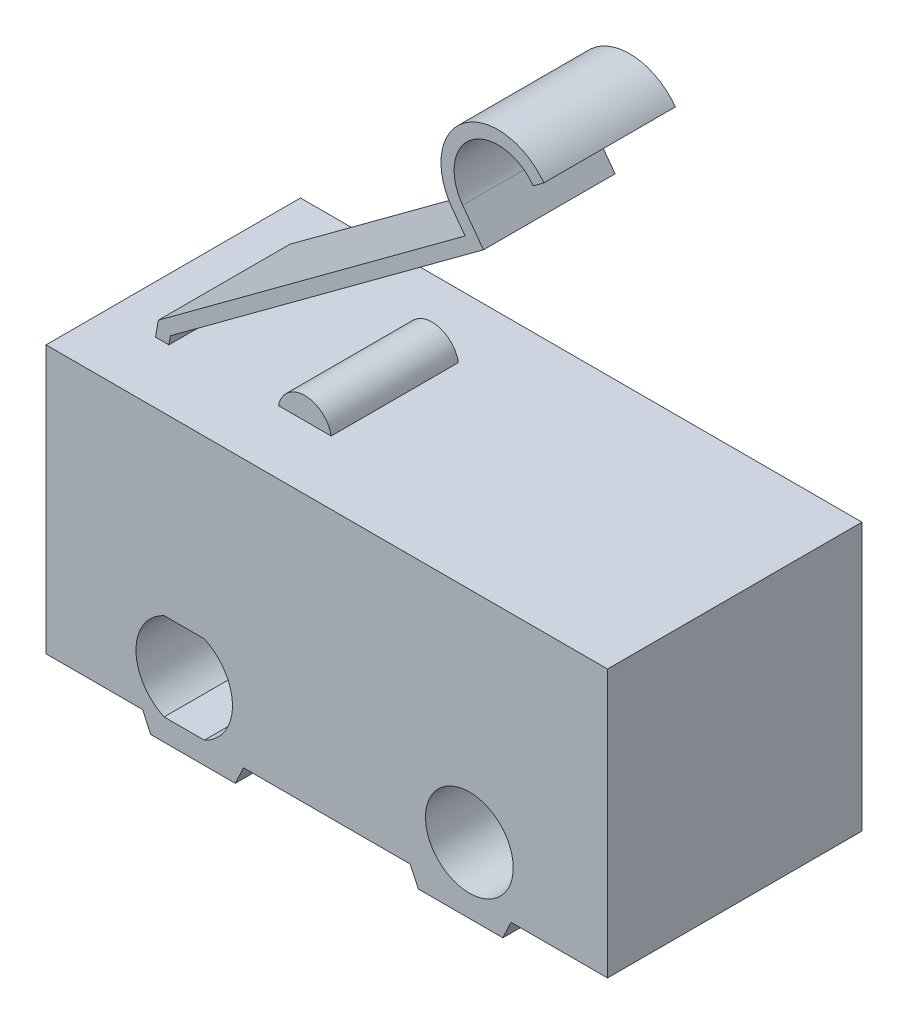
ISO-10303-21;
HEADER;
FILE_DESCRIPTION(('STEP AP214'),'2;1');
FILE_NAME('part.step','',(''),(''),'','','');
FILE_SCHEMA(('AUTOMOTIVE_DESIGN { 1 0 10303 214 1 1 1 1 }'));
ENDSEC;
DATA;
#1=APPLICATION_CONTEXT('core data for automotive mechanical design processes');
#2=APPLICATION_PROTOCOL_DEFINITION('international standard','automotive_design',2000,#1);
#3=PRODUCT_CONTEXT('',#1,'mechanical');
#4=PRODUCT('Part','Part','',(#3));
#5=PRODUCT_RELATED_PRODUCT_CATEGORY('part','',(#4));
#6=PRODUCT_DEFINITION_FORMATION('','',#4);
#7=PRODUCT_DEFINITION_CONTEXT('part definition',#1,'design');
#8=PRODUCT_DEFINITION('design','',#6,#7);
#9=PRODUCT_DEFINITION_SHAPE('','',#8);
#10=(LENGTH_UNIT() NAMED_UNIT(*) SI_UNIT(.MILLI.,.METRE.));
#11=(NAMED_UNIT(*) PLANE_ANGLE_UNIT() SI_UNIT($,.RADIAN.));
#12=(NAMED_UNIT(*) SI_UNIT($,.STERADIAN.) SOLID_ANGLE_UNIT());
#13=UNCERTAINTY_MEASURE_WITH_UNIT(LENGTH_MEASURE(1.E-05),#10,'distance_accuracy_value','');
#14=(GEOMETRIC_REPRESENTATION_CONTEXT(3) GLOBAL_UNCERTAINTY_ASSIGNED_CONTEXT((#13)) GLOBAL_UNIT_ASSIGNED_CONTEXT((#10,
#11,#12)) REPRESENTATION_CONTEXT('',''));
#15=CARTESIAN_POINT('',(0.,0.,0.));
#16=DIRECTION('',(0.,0.,1.));
#17=DIRECTION('',(1.,0.,0.));
#18=AXIS2_PLACEMENT_3D('',#15,#16,#17);
#19=CARTESIAN_POINT('',(0.,6.5,0.));
#20=DIRECTION('',(0.,1.,0.));
#21=DIRECTION('',(0.,0.,1.));
#22=AXIS2_PLACEMENT_3D('',#19,#20,#21);
#23=PLANE('',#22);
#24=DIRECTION('',(0.,0.,-1.));
#25=VECTOR('',#24,1.);
#26=CARTESIAN_POINT('',(-5.30572957496815,6.5,-0.75));
#27=LINE('',#26,#25);
#28=CARTESIAN_POINT('',(-5.30572957496815,6.5,1.5));
#29=VERTEX_POINT('',#28);
#30=CARTESIAN_POINT('',(-5.30572957496815,6.5,-1.5));
#31=VERTEX_POINT('',#30);
#32=EDGE_CURVE('E11',#29,#31,#27,.T.);
#33=ORIENTED_EDGE('',*,*,#32,.T.);
#34=DIRECTION('',(1.,0.,0.));
#35=VECTOR('',#34,1.);
#36=CARTESIAN_POINT('',(-0.390223600528357,6.5,-1.5));
#37=LINE('',#36,#35);
#38=CARTESIAN_POINT('',(-5.00000297242953,6.5,-1.5));
#39=VERTEX_POINT('',#38);
#40=EDGE_CURVE('E20',#31,#39,#37,.T.);
#41=ORIENTED_EDGE('',*,*,#40,.T.);
#42=DIRECTION('',(0.,0.,1.));
#43=VECTOR('',#42,1.);
#44=CARTESIAN_POINT('',(-5.00000297242953,6.5,-0.75));
#45=LINE('',#44,#43);
#46=CARTESIAN_POINT('',(-5.00000297242953,6.5,1.5));
#47=VERTEX_POINT('',#46);
#48=EDGE_CURVE('E346',#39,#47,#45,.T.);
#49=ORIENTED_EDGE('',*,*,#48,.T.);
#50=DIRECTION('',(-1.,0.,0.));
#51=VECTOR('',#50,1.);
#52=CARTESIAN_POINT('',(-0.390223600528357,6.5,1.5));
#53=LINE('',#52,#51);
#54=EDGE_CURVE('E313',#47,#29,#53,.T.);
#55=ORIENTED_EDGE('',*,*,#54,.T.);
#56=EDGE_LOOP('',(#33,#41,#49,#55));
#57=FACE_BOUND('',#56,.T.);
#58=DIRECTION('',(0.,0.,1.));
#59=VECTOR('',#58,1.);
#60=CARTESIAN_POINT('',(-1.35,6.5,0.));
#61=LINE('',#60,#59);
#62=CARTESIAN_POINT('',(-1.35,6.5,-1.45));
#63=VERTEX_POINT('',#62);
#64=CARTESIAN_POINT('',(-1.35,6.5,1.45));
#65=VERTEX_POINT('',#64);
#66=EDGE_CURVE('E310',#63,#65,#61,.T.);
#67=ORIENTED_EDGE('',*,*,#66,.T.);
#68=DIRECTION('',(-1.,0.,0.));
#69=VECTOR('',#68,1.);
#70=CARTESIAN_POINT('',(-0.975,6.5,1.45));
#71=LINE('',#70,#69);
#72=CARTESIAN_POINT('',(-2.55,6.5,1.45));
#73=VERTEX_POINT('',#72);
#74=EDGE_CURVE('E314',#65,#73,#71,.T.);
#75=ORIENTED_EDGE('',*,*,#74,.T.);
#76=DIRECTION('',(0.,0.,-1.));
#77=VECTOR('',#76,1.);
#78=CARTESIAN_POINT('',(-2.55,6.5,0.));
#79=LINE('',#78,#77);
#80=CARTESIAN_POINT('',(-2.55,6.5,-1.45));
#81=VERTEX_POINT('',#80);
#82=EDGE_CURVE('E290',#73,#81,#79,.T.);
#83=ORIENTED_EDGE('',*,*,#82,.T.);
#84=DIRECTION('',(1.,0.,0.));
#85=VECTOR('',#84,1.);
#86=CARTESIAN_POINT('',(-0.975,6.5,-1.45));
#87=LINE('',#86,#85);
#88=EDGE_CURVE('E287',#81,#63,#87,.T.);
#89=ORIENTED_EDGE('',*,*,#88,.T.);
#90=EDGE_LOOP('',(#67,#75,#83,#89));
#91=FACE_BOUND('',#90,.T.);
#92=DIRECTION('',(0.,0.,-1.));
#93=VECTOR('',#92,1.);
#94=CARTESIAN_POINT('',(6.4,6.5,0.));
#95=LINE('',#94,#93);
#96=CARTESIAN_POINT('',(6.4,6.5,2.9));
#97=VERTEX_POINT('',#96);
#98=CARTESIAN_POINT('',(6.4,6.5,-2.9));
#99=VERTEX_POINT('',#98);
#100=EDGE_CURVE('E291',#97,#99,#95,.T.);
#101=ORIENTED_EDGE('',*,*,#100,.T.);
#102=DIRECTION('',(1.,0.,0.));
#103=VECTOR('',#102,1.);
#104=CARTESIAN_POINT('',(0.,6.5,-2.9));
#105=LINE('',#104,#103);
#106=CARTESIAN_POINT('',(-6.4,6.5,-2.9));
#107=VERTEX_POINT('',#106);
#108=EDGE_CURVE('E225',#107,#99,#105,.T.);
#109=ORIENTED_EDGE('',*,*,#108,.F.);
#110=DIRECTION('',(0.,0.,-1.));
#111=VECTOR('',#110,1.);
#112=CARTESIAN_POINT('',(-6.4,6.5,0.));
#113=LINE('',#112,#111);
#114=CARTESIAN_POINT('',(-6.4,6.5,2.9));
#115=VERTEX_POINT('',#114);
#116=EDGE_CURVE('E256',#115,#107,#113,.T.);
#117=ORIENTED_EDGE('',*,*,#116,.F.);
#118=DIRECTION('',(-1.,0.,0.));
#119=VECTOR('',#118,1.);
#120=CARTESIAN_POINT('',(0.,6.5,2.9));
#121=LINE('',#120,#119);
#122=EDGE_CURVE('E298',#97,#115,#121,.T.);
#123=ORIENTED_EDGE('',*,*,#122,.F.);
#124=EDGE_LOOP('',(#101,#109,#117,#123));
#125=FACE_BOUND('',#124,.T.);
#126=ADVANCED_FACE('F16',(#57,#91,#125),#23,.T.);
#127=CARTESIAN_POINT('',(-6.4,3.25,0.));
#128=DIRECTION('',(-1.,0.,0.));
#129=DIRECTION('',(0.,0.,1.));
#130=AXIS2_PLACEMENT_3D('',#127,#128,#129);
#131=PLANE('',#130);
#132=DIRECTION('',(0.,0.,1.));
#133=VECTOR('',#132,1.);
#134=CARTESIAN_POINT('',(-6.4,0.400000000000001,-2.5));
#135=LINE('',#134,#133);
#136=CARTESIAN_POINT('',(-6.4,0.400000000000001,-2.9));
#137=VERTEX_POINT('',#136);
#138=CARTESIAN_POINT('',(-6.4,0.400000000000001,2.9));
#139=VERTEX_POINT('',#138);
#140=EDGE_CURVE('E259',#137,#139,#135,.T.);
#141=ORIENTED_EDGE('',*,*,#140,.T.);
#142=DIRECTION('',(0.,-1.,0.));
#143=VECTOR('',#142,1.);
#144=CARTESIAN_POINT('',(-6.4,3.25,2.9));
#145=LINE('',#144,#143);
#146=EDGE_CURVE('E295',#115,#139,#145,.T.);
#147=ORIENTED_EDGE('',*,*,#146,.F.);
#148=ORIENTED_EDGE('',*,*,#116,.T.);
#149=DIRECTION('',(0.,1.,0.));
#150=VECTOR('',#149,1.);
#151=CARTESIAN_POINT('',(-6.4,3.25,-2.9));
#152=LINE('',#151,#150);
#153=EDGE_CURVE('E228',#137,#107,#152,.T.);
#154=ORIENTED_EDGE('',*,*,#153,.F.);
#155=EDGE_LOOP('',(#141,#147,#148,#154));
#156=FACE_BOUND('',#155,.T.);
#157=ADVANCED_FACE('F500',(#156),#131,.T.);
#158=CARTESIAN_POINT('',(0.,0.,0.));
#159=DIRECTION('',(0.,-1.,0.));
#160=DIRECTION('',(0.,0.,-1.));
#161=AXIS2_PLACEMENT_3D('',#158,#159,#160);
#162=PLANE('',#161);
#163=DIRECTION('',(0.,0.,1.));
#164=VECTOR('',#163,1.);
#165=CARTESIAN_POINT('',(4.013476936738,0.,-2.5));
#166=LINE('',#165,#164);
#167=CARTESIAN_POINT('',(4.013476936738,0.,-2.9));
#168=VERTEX_POINT('',#167);
#169=CARTESIAN_POINT('',(4.013476936738,0.,2.9));
#170=VERTEX_POINT('',#169);
#171=EDGE_CURVE('E237',#168,#170,#166,.T.);
#172=ORIENTED_EDGE('',*,*,#171,.T.);
#173=DIRECTION('',(1.,0.,0.));
#174=VECTOR('',#173,1.);
#175=CARTESIAN_POINT('',(0.,0.,2.9));
#176=LINE('',#175,#174);
#177=CARTESIAN_POINT('',(2.086523063262,0.,2.9));
#178=VERTEX_POINT('',#177);
#179=EDGE_CURVE('E376',#178,#170,#176,.T.);
#180=ORIENTED_EDGE('',*,*,#179,.F.);
#181=DIRECTION('',(0.,0.,-1.));
#182=VECTOR('',#181,1.);
#183=CARTESIAN_POINT('',(2.086523063262,0.,-2.5));
#184=LINE('',#183,#182);
#185=CARTESIAN_POINT('',(2.086523063262,0.,-2.9));
#186=VERTEX_POINT('',#185);
#187=EDGE_CURVE('E234',#178,#186,#184,.T.);
#188=ORIENTED_EDGE('',*,*,#187,.T.);
#189=DIRECTION('',(-1.,0.,0.));
#190=VECTOR('',#189,1.);
#191=CARTESIAN_POINT('',(0.,0.,-2.9));
#192=LINE('',#191,#190);
#193=EDGE_CURVE('E230',#168,#186,#192,.T.);
#194=ORIENTED_EDGE('',*,*,#193,.F.);
#195=EDGE_LOOP('',(#172,#180,#188,#194));
#196=FACE_BOUND('',#195,.T.);
#197=ADVANCED_FACE('F483',(#196),#162,.T.);
#198=CARTESIAN_POINT('',(0.,3.25,2.9));
#199=DIRECTION('',(0.,0.,1.));
#200=DIRECTION('',(1.,0.,0.));
#201=AXIS2_PLACEMENT_3D('',#198,#199,#200);
#202=PLANE('',#201);
#203=CARTESIAN_POINT('',(3.25,1.5,2.9));
#204=DIRECTION('',(0.,0.,-1.));
#205=DIRECTION('',(1.,0.,0.));
#206=AXIS2_PLACEMENT_3D('',#203,#204,#205);
#207=CIRCLE('',#206,1.);
#208=CARTESIAN_POINT('',(4.25,1.5,2.9));
#209=VERTEX_POINT('',#208);
#210=EDGE_CURVE('E238',#209,#209,#207,.T.);
#211=ORIENTED_EDGE('',*,*,#210,.T.);
#212=EDGE_LOOP('',(#211));
#213=FACE_BOUND('',#212,.T.);
#214=DIRECTION('',(1.,0.,0.));
#215=VECTOR('',#214,1.);
#216=CARTESIAN_POINT('',(-1.25,2.5,2.9));
#217=LINE('',#216,#215);
#218=CARTESIAN_POINT('',(-3.70825756949558,2.5,2.9));
#219=VERTEX_POINT('',#218);
#220=CARTESIAN_POINT('',(-2.79174243050442,2.5,2.9));
#221=VERTEX_POINT('',#220);
#222=EDGE_CURVE('E245',#219,#221,#217,.T.);
#223=ORIENTED_EDGE('',*,*,#222,.T.);
#224=CARTESIAN_POINT('',(-3.25,1.5,2.9));
#225=DIRECTION('',(0.,0.,-1.));
#226=DIRECTION('',(1.,0.,0.));
#227=AXIS2_PLACEMENT_3D('',#224,#225,#226);
#228=CIRCLE('',#227,1.1);
#229=CARTESIAN_POINT('',(-2.79174243050442,0.5,2.9));
#230=VERTEX_POINT('',#229);
#231=EDGE_CURVE('E283',#221,#230,#228,.T.);
#232=ORIENTED_EDGE('',*,*,#231,.T.);
#233=DIRECTION('',(-1.,0.,0.));
#234=VECTOR('',#233,1.);
#235=CARTESIAN_POINT('',(-1.25,0.5,2.9));
#236=LINE('',#235,#234);
#237=CARTESIAN_POINT('',(-3.70825756949558,0.5,2.9));
#238=VERTEX_POINT('',#237);
#239=EDGE_CURVE('E280',#230,#238,#236,.T.);
#240=ORIENTED_EDGE('',*,*,#239,.T.);
#241=CARTESIAN_POINT('',(-3.25,1.5,2.9));
#242=DIRECTION('',(0.,0.,-1.));
#243=DIRECTION('',(1.,0.,0.));
#244=AXIS2_PLACEMENT_3D('',#241,#242,#243);
#245=CIRCLE('',#244,1.1);
#246=EDGE_CURVE('E272',#238,#219,#245,.T.);
#247=ORIENTED_EDGE('',*,*,#246,.T.);
#248=EDGE_LOOP('',(#223,#232,#240,#247));
#249=FACE_BOUND('',#248,.T.);
#250=DIRECTION('',(1.,0.,0.));
#251=VECTOR('',#250,1.);
#252=CARTESIAN_POINT('',(2.1,0.400000000000001,2.9));
#253=LINE('',#252,#251);
#254=CARTESIAN_POINT('',(4.2,0.400000000000001,2.9));
#255=VERTEX_POINT('',#254);
#256=CARTESIAN_POINT('',(6.4,0.400000000000001,2.9));
#257=VERTEX_POINT('',#256);
#258=EDGE_CURVE('E269',#255,#257,#253,.T.);
#259=ORIENTED_EDGE('',*,*,#258,.T.);
#260=DIRECTION('',(0.,1.,0.));
#261=VECTOR('',#260,1.);
#262=CARTESIAN_POINT('',(6.4,3.25,2.9));
#263=LINE('',#262,#261);
#264=EDGE_CURVE('E273',#257,#97,#263,.T.);
#265=ORIENTED_EDGE('',*,*,#264,.T.);
#266=ORIENTED_EDGE('',*,*,#122,.T.);
#267=ORIENTED_EDGE('',*,*,#146,.T.);
#268=DIRECTION('',(1.,0.,0.));
#269=VECTOR('',#268,1.);
#270=CARTESIAN_POINT('',(-3.6,0.400000000000001,2.9));
#271=LINE('',#270,#269);
#272=CARTESIAN_POINT('',(-4.2,0.400000000000001,2.9));
#273=VERTEX_POINT('',#272);
#274=EDGE_CURVE('E268',#139,#273,#271,.T.);
#275=ORIENTED_EDGE('',*,*,#274,.T.);
#276=DIRECTION('',(0.4226182617407,-0.90630778703665,0.));
#277=VECTOR('',#276,1.);
#278=CARTESIAN_POINT('',(-4.37073365589314,0.766139506626731,2.9));
#279=LINE('',#278,#277);
#280=CARTESIAN_POINT('',(-4.013476936738,0.,2.9));
#281=VERTEX_POINT('',#280);
#282=EDGE_CURVE('E265',#273,#281,#279,.T.);
#283=ORIENTED_EDGE('',*,*,#282,.T.);
#284=DIRECTION('',(1.,0.,0.));
#285=VECTOR('',#284,1.);
#286=CARTESIAN_POINT('',(0.,0.,2.9));
#287=LINE('',#286,#285);
#288=CARTESIAN_POINT('',(-2.086523063262,0.,2.9));
#289=VERTEX_POINT('',#288);
#290=EDGE_CURVE('E263',#281,#289,#287,.T.);
#291=ORIENTED_EDGE('',*,*,#290,.T.);
#292=DIRECTION('',(0.422618261740699,0.90630778703665,0.));
#293=VECTOR('',#292,1.);
#294=CARTESIAN_POINT('',(-1.37104051214083,1.53435728238317,2.9));
#295=LINE('',#294,#293);
#296=CARTESIAN_POINT('',(-1.9,0.400000000000001,2.9));
#297=VERTEX_POINT('',#296);
#298=EDGE_CURVE('E260',#289,#297,#295,.T.);
#299=ORIENTED_EDGE('',*,*,#298,.T.);
#300=DIRECTION('',(1.,0.,0.));
#301=VECTOR('',#300,1.);
#302=CARTESIAN_POINT('',(-0.95,0.4,2.9));
#303=LINE('',#302,#301);
#304=CARTESIAN_POINT('',(1.9,0.4,2.9));
#305=VERTEX_POINT('',#304);
#306=EDGE_CURVE('E264',#297,#305,#303,.T.);
#307=ORIENTED_EDGE('',*,*,#306,.T.);
#308=DIRECTION('',(0.422618261740699,-0.90630778703665,0.));
#309=VECTOR('',#308,1.);
#310=CARTESIAN_POINT('',(1.18451744887884,1.93435728238317,2.9));
#311=LINE('',#310,#309);
#312=EDGE_CURVE('E353',#305,#178,#311,.T.);
#313=ORIENTED_EDGE('',*,*,#312,.T.);
#314=ORIENTED_EDGE('',*,*,#179,.T.);
#315=DIRECTION('',(0.4226182617407,0.90630778703665,0.));
#316=VECTOR('',#315,1.);
#317=CARTESIAN_POINT('',(4.18421059263114,0.366139506626731,2.9));
#318=LINE('',#317,#316);
#319=EDGE_CURVE('E379',#170,#255,#318,.T.);
#320=ORIENTED_EDGE('',*,*,#319,.T.);
#321=EDGE_LOOP('',(#259,#265,#266,#267,#275,#283,#291,#299,#307,#313,#314,#320));
#322=FACE_BOUND('',#321,.T.);
#323=ADVANCED_FACE('F461',(#213,#249,#322),#202,.T.);
#324=CARTESIAN_POINT('',(-2.5,2.5,0.));
#325=DIRECTION('',(0.,-1.,0.));
#326=DIRECTION('',(0.,0.,-1.));
#327=AXIS2_PLACEMENT_3D('',#324,#325,#326);
#328=PLANE('',#327);
#329=ORIENTED_EDGE('',*,*,#222,.F.);
#330=DIRECTION('',(0.,0.,1.));
#331=VECTOR('',#330,1.);
#332=CARTESIAN_POINT('',(-3.70825756949558,2.5,0.));
#333=LINE('',#332,#331);
#334=CARTESIAN_POINT('',(-3.70825756949558,2.5,-2.9));
#335=VERTEX_POINT('',#334);
#336=EDGE_CURVE('E160',#335,#219,#333,.T.);
#337=ORIENTED_EDGE('',*,*,#336,.F.);
#338=DIRECTION('',(-1.,0.,0.));
#339=VECTOR('',#338,1.);
#340=CARTESIAN_POINT('',(-1.25,2.5,-2.9));
#341=LINE('',#340,#339);
#342=CARTESIAN_POINT('',(-2.79174243050442,2.5,-2.9));
#343=VERTEX_POINT('',#342);
#344=EDGE_CURVE('E345',#343,#335,#341,.T.);
#345=ORIENTED_EDGE('',*,*,#344,.F.);
#346=DIRECTION('',(0.,0.,-1.));
#347=VECTOR('',#346,1.);
#348=CARTESIAN_POINT('',(-2.79174243050442,2.5,0.));
#349=LINE('',#348,#347);
#350=EDGE_CURVE('E278',#221,#343,#349,.T.);
#351=ORIENTED_EDGE('',*,*,#350,.F.);
#352=EDGE_LOOP('',(#329,#337,#345,#351));
#353=FACE_BOUND('',#352,.T.);
#354=ADVANCED_FACE('F530',(#353),#328,.T.);
#355=CARTESIAN_POINT('',(-2.5,0.5,0.));
#356=DIRECTION('',(0.,1.,0.));
#357=DIRECTION('',(0.,0.,1.));
#358=AXIS2_PLACEMENT_3D('',#355,#356,#357);
#359=PLANE('',#358);
#360=ORIENTED_EDGE('',*,*,#239,.F.);
#361=DIRECTION('',(0.,0.,1.));
#362=VECTOR('',#361,1.);
#363=CARTESIAN_POINT('',(-2.79174243050442,0.5,0.));
#364=LINE('',#363,#362);
#365=CARTESIAN_POINT('',(-2.79174243050442,0.5,-2.9));
#366=VERTEX_POINT('',#365);
#367=EDGE_CURVE('E371',#366,#230,#364,.T.);
#368=ORIENTED_EDGE('',*,*,#367,.F.);
#369=DIRECTION('',(1.,0.,0.));
#370=VECTOR('',#369,1.);
#371=CARTESIAN_POINT('',(-1.25,0.5,-2.9));
#372=LINE('',#371,#370);
#373=CARTESIAN_POINT('',(-3.70825756949558,0.5,-2.9));
#374=VERTEX_POINT('',#373);
#375=EDGE_CURVE('E332',#374,#366,#372,.T.);
#376=ORIENTED_EDGE('',*,*,#375,.F.);
#377=DIRECTION('',(0.,0.,-1.));
#378=VECTOR('',#377,1.);
#379=CARTESIAN_POINT('',(-3.70825756949558,0.5,0.));
#380=LINE('',#379,#378);
#381=EDGE_CURVE('E276',#238,#374,#380,.T.);
#382=ORIENTED_EDGE('',*,*,#381,.F.);
#383=EDGE_LOOP('',(#360,#368,#376,#382));
#384=FACE_BOUND('',#383,.T.);
#385=ADVANCED_FACE('F534',(#384),#359,.T.);
#386=CARTESIAN_POINT('',(0.,0.,0.));
#387=DIRECTION('',(0.,-1.,0.));
#388=DIRECTION('',(0.,0.,-1.));
#389=AXIS2_PLACEMENT_3D('',#386,#387,#388);
#390=PLANE('',#389);
#391=DIRECTION('',(0.,0.,-1.));
#392=VECTOR('',#391,1.);
#393=CARTESIAN_POINT('',(-4.013476936738,0.,-2.5));
#394=LINE('',#393,#392);
#395=CARTESIAN_POINT('',(-4.013476936738,0.,-2.9));
#396=VERTEX_POINT('',#395);
#397=EDGE_CURVE('E216',#281,#396,#394,.T.);
#398=ORIENTED_EDGE('',*,*,#397,.T.);
#399=DIRECTION('',(-1.,0.,0.));
#400=VECTOR('',#399,1.);
#401=CARTESIAN_POINT('',(0.,0.,-2.9));
#402=LINE('',#401,#400);
#403=CARTESIAN_POINT('',(-2.086523063262,0.,-2.9));
#404=VERTEX_POINT('',#403);
#405=EDGE_CURVE('E341',#404,#396,#402,.T.);
#406=ORIENTED_EDGE('',*,*,#405,.F.);
#407=DIRECTION('',(0.,0.,1.));
#408=VECTOR('',#407,1.);
#409=CARTESIAN_POINT('',(-2.086523063262,0.,-2.5));
#410=LINE('',#409,#408);
#411=EDGE_CURVE('E342',#404,#289,#410,.T.);
#412=ORIENTED_EDGE('',*,*,#411,.T.);
#413=ORIENTED_EDGE('',*,*,#290,.F.);
#414=EDGE_LOOP('',(#398,#406,#412,#413));
#415=FACE_BOUND('',#414,.T.);
#416=ADVANCED_FACE('F467',(#415),#390,.T.);
#417=CARTESIAN_POINT('',(0.,3.25,-2.9));
#418=DIRECTION('',(0.,0.,-1.));
#419=DIRECTION('',(-1.,0.,0.));
#420=AXIS2_PLACEMENT_3D('',#417,#418,#419);
#421=PLANE('',#420);
#422=ORIENTED_EDGE('',*,*,#344,.T.);
#423=CARTESIAN_POINT('',(-3.25,1.5,-2.9));
#424=DIRECTION('',(0.,0.,1.));
#425=DIRECTION('',(1.,0.,0.));
#426=AXIS2_PLACEMENT_3D('',#423,#424,#425);
#427=CIRCLE('',#426,1.1);
#428=EDGE_CURVE('E334',#335,#374,#427,.T.);
#429=ORIENTED_EDGE('',*,*,#428,.T.);
#430=ORIENTED_EDGE('',*,*,#375,.T.);
#431=CARTESIAN_POINT('',(-3.25,1.5,-2.9));
#432=DIRECTION('',(0.,0.,1.));
#433=DIRECTION('',(1.,0.,0.));
#434=AXIS2_PLACEMENT_3D('',#431,#432,#433);
#435=CIRCLE('',#434,1.1);
#436=EDGE_CURVE('E168',#366,#343,#435,.T.);
#437=ORIENTED_EDGE('',*,*,#436,.T.);
#438=EDGE_LOOP('',(#422,#429,#430,#437));
#439=FACE_BOUND('',#438,.T.);
#440=CARTESIAN_POINT('',(3.25,1.5,-2.9));
#441=DIRECTION('',(0.,0.,1.));
#442=DIRECTION('',(1.,0.,0.));
#443=AXIS2_PLACEMENT_3D('',#440,#441,#442);
#444=CIRCLE('',#443,1.);
#445=CARTESIAN_POINT('',(4.25,1.5,-2.9));
#446=VERTEX_POINT('',#445);
#447=EDGE_CURVE('E221',#446,#446,#444,.T.);
#448=ORIENTED_EDGE('',*,*,#447,.T.);
#449=EDGE_LOOP('',(#448));
#450=FACE_BOUND('',#449,.T.);
#451=DIRECTION('',(-1.,0.,0.));
#452=VECTOR('',#451,1.);
#453=CARTESIAN_POINT('',(2.1,0.400000000000001,-2.9));
#454=LINE('',#453,#452);
#455=CARTESIAN_POINT('',(6.4,0.400000000000001,-2.9));
#456=VERTEX_POINT('',#455);
#457=CARTESIAN_POINT('',(4.2,0.400000000000001,-2.9));
#458=VERTEX_POINT('',#457);
#459=EDGE_CURVE('E224',#456,#458,#454,.T.);
#460=ORIENTED_EDGE('',*,*,#459,.T.);
#461=DIRECTION('',(-0.4226182617407,-0.90630778703665,0.));
#462=VECTOR('',#461,1.);
#463=CARTESIAN_POINT('',(4.18421059263114,0.366139506626731,-2.9));
#464=LINE('',#463,#462);
#465=EDGE_CURVE('E232',#458,#168,#464,.T.);
#466=ORIENTED_EDGE('',*,*,#465,.T.);
#467=ORIENTED_EDGE('',*,*,#193,.T.);
#468=DIRECTION('',(-0.422618261740699,0.90630778703665,0.));
#469=VECTOR('',#468,1.);
#470=CARTESIAN_POINT('',(1.18451744887884,1.93435728238317,-2.9));
#471=LINE('',#470,#469);
#472=CARTESIAN_POINT('',(1.9,0.4,-2.9));
#473=VERTEX_POINT('',#472);
#474=EDGE_CURVE('E233',#186,#473,#471,.T.);
#475=ORIENTED_EDGE('',*,*,#474,.T.);
#476=DIRECTION('',(-1.,0.,0.));
#477=VECTOR('',#476,1.);
#478=CARTESIAN_POINT('',(-0.95,0.4,-2.9));
#479=LINE('',#478,#477);
#480=CARTESIAN_POINT('',(-1.9,0.400000000000001,-2.9));
#481=VERTEX_POINT('',#480);
#482=EDGE_CURVE('E335',#473,#481,#479,.T.);
#483=ORIENTED_EDGE('',*,*,#482,.T.);
#484=DIRECTION('',(-0.422618261740699,-0.90630778703665,0.));
#485=VECTOR('',#484,1.);
#486=CARTESIAN_POINT('',(-1.37104051214083,1.53435728238317,-2.9));
#487=LINE('',#486,#485);
#488=EDGE_CURVE('E338',#481,#404,#487,.T.);
#489=ORIENTED_EDGE('',*,*,#488,.T.);
#490=ORIENTED_EDGE('',*,*,#405,.T.);
#491=DIRECTION('',(-0.4226182617407,0.90630778703665,0.));
#492=VECTOR('',#491,1.);
#493=CARTESIAN_POINT('',(-4.37073365589314,0.766139506626731,-2.9));
#494=LINE('',#493,#492);
#495=CARTESIAN_POINT('',(-4.2,0.400000000000001,-2.9));
#496=VERTEX_POINT('',#495);
#497=EDGE_CURVE('E356',#396,#496,#494,.T.);
#498=ORIENTED_EDGE('',*,*,#497,.T.);
#499=DIRECTION('',(-1.,0.,0.));
#500=VECTOR('',#499,1.);
#501=CARTESIAN_POINT('',(-3.6,0.400000000000001,-2.9));
#502=LINE('',#501,#500);
#503=EDGE_CURVE('E359',#496,#137,#502,.T.);
#504=ORIENTED_EDGE('',*,*,#503,.T.);
#505=ORIENTED_EDGE('',*,*,#153,.T.);
#506=ORIENTED_EDGE('',*,*,#108,.T.);
#507=DIRECTION('',(0.,-1.,0.));
#508=VECTOR('',#507,1.);
#509=CARTESIAN_POINT('',(6.4,3.25,-2.9));
#510=LINE('',#509,#508);
#511=EDGE_CURVE('E229',#99,#456,#510,.T.);
#512=ORIENTED_EDGE('',*,*,#511,.T.);
#513=EDGE_LOOP('',(#460,#466,#467,#475,#483,#489,#490,#498,#504,#505,#506,#512));
#514=FACE_BOUND('',#513,.T.);
#515=ADVANCED_FACE('F475',(#439,#450,#514),#421,.T.);
#516=CARTESIAN_POINT('',(6.4,3.25,0.));
#517=DIRECTION('',(1.,0.,0.));
#518=DIRECTION('',(0.,0.,-1.));
#519=AXIS2_PLACEMENT_3D('',#516,#517,#518);
#520=PLANE('',#519);
#521=DIRECTION('',(0.,0.,-1.));
#522=VECTOR('',#521,1.);
#523=CARTESIAN_POINT('',(6.4,0.400000000000001,-2.5));
#524=LINE('',#523,#522);
#525=EDGE_CURVE('E320',#257,#456,#524,.T.);
#526=ORIENTED_EDGE('',*,*,#525,.T.);
#527=ORIENTED_EDGE('',*,*,#511,.F.);
#528=ORIENTED_EDGE('',*,*,#100,.F.);
#529=ORIENTED_EDGE('',*,*,#264,.F.);
#530=EDGE_LOOP('',(#526,#527,#528,#529));
#531=FACE_BOUND('',#530,.T.);
#532=ADVANCED_FACE('F495',(#531),#520,.T.);
#533=CARTESIAN_POINT('',(-1.9,0.400000000000001,-5.));
#534=DIRECTION('',(0.,-1.,0.));
#535=DIRECTION('',(0.,0.,-1.));
#536=AXIS2_PLACEMENT_3D('',#533,#534,#535);
#537=PLANE('',#536);
#538=ORIENTED_EDGE('',*,*,#306,.F.);
#539=DIRECTION('',(0.,0.,1.));
#540=VECTOR('',#539,1.);
#541=CARTESIAN_POINT('',(-1.9,0.400000000000001,-5.));
#542=LINE('',#541,#540);
#543=EDGE_CURVE('E246',#481,#297,#542,.T.);
#544=ORIENTED_EDGE('',*,*,#543,.F.);
#545=ORIENTED_EDGE('',*,*,#482,.F.);
#546=DIRECTION('',(0.,0.,1.));
#547=VECTOR('',#546,1.);
#548=CARTESIAN_POINT('',(1.9,0.4,-5.));
#549=LINE('',#548,#547);
#550=EDGE_CURVE('E249',#473,#305,#549,.T.);
#551=ORIENTED_EDGE('',*,*,#550,.T.);
#552=EDGE_LOOP('',(#538,#544,#545,#551));
#553=FACE_BOUND('',#552,.T.);
#554=ADVANCED_FACE('F473',(#553),#537,.T.);
#555=CARTESIAN_POINT('',(-2.273046126524,-0.399999999999999,-5.));
#556=DIRECTION('',(0.90630778703665,-0.422618261740699,0.));
#557=DIRECTION('',(0.422618261740699,0.90630778703665,0.));
#558=AXIS2_PLACEMENT_3D('',#555,#556,#557);
#559=PLANE('',#558);
#560=ORIENTED_EDGE('',*,*,#298,.F.);
#561=ORIENTED_EDGE('',*,*,#411,.F.);
#562=ORIENTED_EDGE('',*,*,#488,.F.);
#563=ORIENTED_EDGE('',*,*,#543,.T.);
#564=EDGE_LOOP('',(#560,#561,#562,#563));
#565=FACE_BOUND('',#564,.T.);
#566=ADVANCED_FACE('F470',(#565),#559,.T.);
#567=CARTESIAN_POINT('',(-7.2,0.400000000000001,-5.));
#568=DIRECTION('',(0.,-1.,0.));
#569=DIRECTION('',(0.,0.,-1.));
#570=AXIS2_PLACEMENT_3D('',#567,#568,#569);
#571=PLANE('',#570);
#572=ORIENTED_EDGE('',*,*,#274,.F.);
#573=ORIENTED_EDGE('',*,*,#140,.F.);
#574=ORIENTED_EDGE('',*,*,#503,.F.);
#575=DIRECTION('',(0.,0.,1.));
#576=VECTOR('',#575,1.);
#577=CARTESIAN_POINT('',(-4.2,0.400000000000001,-5.));
#578=LINE('',#577,#576);
#579=EDGE_CURVE('E241',#496,#273,#578,.T.);
#580=ORIENTED_EDGE('',*,*,#579,.T.);
#581=EDGE_LOOP('',(#572,#573,#574,#580));
#582=FACE_BOUND('',#581,.T.);
#583=ADVANCED_FACE('F507',(#582),#571,.T.);
#584=CARTESIAN_POINT('',(3.826953873476,-0.399999999999999,-5.));
#585=DIRECTION('',(0.90630778703665,-0.4226182617407,0.));
#586=DIRECTION('',(0.4226182617407,0.90630778703665,0.));
#587=AXIS2_PLACEMENT_3D('',#584,#585,#586);
#588=PLANE('',#587);
#589=ORIENTED_EDGE('',*,*,#319,.F.);
#590=ORIENTED_EDGE('',*,*,#171,.F.);
#591=ORIENTED_EDGE('',*,*,#465,.F.);
#592=DIRECTION('',(0.,0.,1.));
#593=VECTOR('',#592,1.);
#594=CARTESIAN_POINT('',(4.2,0.400000000000001,-5.));
#595=LINE('',#594,#593);
#596=EDGE_CURVE('E239',#458,#255,#595,.T.);
#597=ORIENTED_EDGE('',*,*,#596,.T.);
#598=EDGE_LOOP('',(#589,#590,#591,#597));
#599=FACE_BOUND('',#598,.T.);
#600=ADVANCED_FACE('F487',(#599),#588,.T.);
#601=CARTESIAN_POINT('',(1.9,0.4,-5.));
#602=DIRECTION('',(-0.90630778703665,-0.422618261740699,0.));
#603=DIRECTION('',(0.422618261740699,-0.90630778703665,0.));
#604=AXIS2_PLACEMENT_3D('',#601,#602,#603);
#605=PLANE('',#604);
#606=ORIENTED_EDGE('',*,*,#312,.F.);
#607=ORIENTED_EDGE('',*,*,#550,.F.);
#608=ORIENTED_EDGE('',*,*,#474,.F.);
#609=ORIENTED_EDGE('',*,*,#187,.F.);
#610=EDGE_LOOP('',(#606,#607,#608,#609));
#611=FACE_BOUND('',#610,.T.);
#612=ADVANCED_FACE('F480',(#611),#605,.T.);
#613=CARTESIAN_POINT('',(-4.2,0.400000000000001,-5.));
#614=DIRECTION('',(-0.90630778703665,-0.4226182617407,0.));
#615=DIRECTION('',(0.4226182617407,-0.90630778703665,0.));
#616=AXIS2_PLACEMENT_3D('',#613,#614,#615);
#617=PLANE('',#616);
#618=ORIENTED_EDGE('',*,*,#282,.F.);
#619=ORIENTED_EDGE('',*,*,#579,.F.);
#620=ORIENTED_EDGE('',*,*,#497,.F.);
#621=ORIENTED_EDGE('',*,*,#397,.F.);
#622=EDGE_LOOP('',(#618,#619,#620,#621));
#623=FACE_BOUND('',#622,.T.);
#624=ADVANCED_FACE('F504',(#623),#617,.T.);
#625=CARTESIAN_POINT('',(4.2,0.400000000000001,-5.));
#626=DIRECTION('',(0.,-1.,0.));
#627=DIRECTION('',(0.,0.,-1.));
#628=AXIS2_PLACEMENT_3D('',#625,#626,#627);
#629=PLANE('',#628);
#630=ORIENTED_EDGE('',*,*,#258,.F.);
#631=ORIENTED_EDGE('',*,*,#596,.F.);
#632=ORIENTED_EDGE('',*,*,#459,.F.);
#633=ORIENTED_EDGE('',*,*,#525,.F.);
#634=EDGE_LOOP('',(#630,#631,#632,#633));
#635=FACE_BOUND('',#634,.T.);
#636=ADVANCED_FACE('F491',(#635),#629,.T.);
#637=CARTESIAN_POINT('',(-0.780447201056714,10.3545743113711,1.5));
#638=DIRECTION('',(0.,0.,1.));
#639=DIRECTION('',(1.,0.,0.));
#640=AXIS2_PLACEMENT_3D('',#637,#638,#639);
#641=PLANE('',#640);
#642=ORIENTED_EDGE('',*,*,#54,.F.);
#643=DIRECTION('',(-0.17350344641622,-0.984833262071146,0.));
#644=VECTOR('',#643,1.);
#645=CARTESIAN_POINT('',(-5.15586988874151,5.61527449851191,1.5));
#646=LINE('',#645,#644);
#647=CARTESIAN_POINT('',(-4.96529732480383,6.69699479675762,1.5));
#648=VERTEX_POINT('',#647);
#649=EDGE_CURVE('E211',#648,#47,#646,.T.);
#650=ORIENTED_EDGE('',*,*,#649,.F.);
#651=DIRECTION('',(-0.804731361607844,-0.593639145984145,0.));
#652=VECTOR('',#651,1.);
#653=CARTESIAN_POINT('',(2.17267221557671,11.9625757647295,1.5));
#654=LINE('',#653,#652);
#655=CARTESIAN_POINT('',(2.17267221557671,11.9625757647295,1.5));
#656=VERTEX_POINT('',#655);
#657=EDGE_CURVE('E209',#656,#648,#654,.T.);
#658=ORIENTED_EDGE('',*,*,#657,.F.);
#659=DIRECTION('',(0.593639145984101,-0.804731361607877,0.));
#660=VECTOR('',#659,1.);
#661=CARTESIAN_POINT('',(2.17267221557671,11.9625757647295,1.5));
#662=LINE('',#661,#660);
#663=CARTESIAN_POINT('',(1.69776089878942,12.6063608540158,1.5));
#664=VERTEX_POINT('',#663);
#665=EDGE_CURVE('E203',#664,#656,#662,.T.);
#666=ORIENTED_EDGE('',*,*,#665,.F.);
#667=CARTESIAN_POINT('',(2.50249226039722,13.2,1.5));
#668=DIRECTION('',(0.,0.,1.));
#669=DIRECTION('',(1.,0.,0.));
#670=AXIS2_PLACEMENT_3D('',#667,#668,#669);
#671=CIRCLE('',#670,1.00000000000002);
#672=CARTESIAN_POINT('',(3.3072236220051,13.7936391459841,1.5));
#673=VERTEX_POINT('',#672);
#674=EDGE_CURVE('E294',#673,#664,#671,.T.);
#675=ORIENTED_EDGE('',*,*,#674,.F.);
#676=DIRECTION('',(-0.804731361607918,-0.593639145984044,0.));
#677=VECTOR('',#676,1.);
#678=CARTESIAN_POINT('',(3.54864303048748,13.9717308897793,1.5));
#679=LINE('',#678,#677);
#680=CARTESIAN_POINT('',(3.54864303048748,13.9717308897793,1.5));
#681=VERTEX_POINT('',#680);
#682=EDGE_CURVE('E275',#681,#673,#679,.T.);
#683=ORIENTED_EDGE('',*,*,#682,.F.);
#684=CARTESIAN_POINT('',(2.50249226039722,13.2,1.5));
#685=DIRECTION('',(0.,0.,-1.));
#686=DIRECTION('',(1.,0.,0.));
#687=AXIS2_PLACEMENT_3D('',#684,#685,#686);
#688=CIRCLE('',#687,1.30000000000003);
#689=CARTESIAN_POINT('',(1.45634149030707,12.4282691102206,1.5));
#690=VERTEX_POINT('',#689);
#691=EDGE_CURVE('E252',#690,#681,#688,.T.);
#692=ORIENTED_EDGE('',*,*,#691,.F.);
#693=DIRECTION('',(-0.593639145984154,0.804731361607837,0.));
#694=VECTOR('',#693,1.);
#695=CARTESIAN_POINT('',(1.75316106329916,12.0259034294166,1.5));
#696=LINE('',#695,#694);
#697=CARTESIAN_POINT('',(1.75316106329916,12.0259034294166,1.5));
#698=VERTEX_POINT('',#697);
#699=EDGE_CURVE('E242',#698,#690,#696,.T.);
#700=ORIENTED_EDGE('',*,*,#699,.F.);
#701=DIRECTION('',(0.804731361607846,0.593639145984143,0.));
#702=VECTOR('',#701,1.);
#703=CARTESIAN_POINT('',(1.75316106329916,12.0259034294166,1.5));
#704=LINE('',#703,#702);
#705=CARTESIAN_POINT('',(-5.23993424956444,6.86719416646503,1.5));
#706=VERTEX_POINT('',#705);
#707=EDGE_CURVE('E306',#706,#698,#704,.T.);
#708=ORIENTED_EDGE('',*,*,#707,.F.);
#709=DIRECTION('',(0.176374957834559,0.984323053803403,0.));
#710=VECTOR('',#709,1.);
#711=CARTESIAN_POINT('',(-5.45482100674143,5.66794234725403,1.5));
#712=LINE('',#711,#710);
#713=EDGE_CURVE('E219',#29,#706,#712,.T.);
#714=ORIENTED_EDGE('',*,*,#713,.F.);
#715=EDGE_LOOP('',(#642,#650,#658,#666,#675,#683,#692,#700,#708,#714));
#716=FACE_BOUND('',#715,.T.);
#717=ADVANCED_FACE('F395',(#716),#641,.T.);
#718=CARTESIAN_POINT('',(1.75316106329916,12.0259034294166,-1.5));
#719=DIRECTION('',(-0.804731361607837,-0.593639145984154,0.));
#720=DIRECTION('',(0.593639145984154,-0.804731361607837,0.));
#721=AXIS2_PLACEMENT_3D('',#718,#719,#720);
#722=PLANE('',#721);
#723=ORIENTED_EDGE('',*,*,#699,.T.);
#724=DIRECTION('',(0.,0.,1.));
#725=VECTOR('',#724,1.);
#726=CARTESIAN_POINT('',(1.45634149030707,12.4282691102206,-1.5));
#727=LINE('',#726,#725);
#728=CARTESIAN_POINT('',(1.45634149030707,12.4282691102206,-1.5));
#729=VERTEX_POINT('',#728);
#730=EDGE_CURVE('E292',#729,#690,#727,.T.);
#731=ORIENTED_EDGE('',*,*,#730,.F.);
#732=DIRECTION('',(-0.593639145984154,0.804731361607837,0.));
#733=VECTOR('',#732,1.);
#734=CARTESIAN_POINT('',(1.75316106329916,12.0259034294166,-1.5));
#735=LINE('',#734,#733);
#736=CARTESIAN_POINT('',(1.75316106329916,12.0259034294166,-1.5));
#737=VERTEX_POINT('',#736);
#738=EDGE_CURVE('E220',#737,#729,#735,.T.);
#739=ORIENTED_EDGE('',*,*,#738,.F.);
#740=DIRECTION('',(0.,0.,1.));
#741=VECTOR('',#740,1.);
#742=CARTESIAN_POINT('',(1.75316106329916,12.0259034294166,-1.5));
#743=LINE('',#742,#741);
#744=EDGE_CURVE('E305',#737,#698,#743,.T.);
#745=ORIENTED_EDGE('',*,*,#744,.T.);
#746=EDGE_LOOP('',(#723,#731,#739,#745));
#747=FACE_BOUND('',#746,.T.);
#748=ADVANCED_FACE('F431',(#747),#722,.T.);
#749=CARTESIAN_POINT('',(-5.23993424956444,6.86719416646503,-1.5));
#750=DIRECTION('',(-0.593639145984143,0.804731361607846,0.));
#751=DIRECTION('',(-0.804731361607846,-0.593639145984143,0.));
#752=AXIS2_PLACEMENT_3D('',#749,#750,#751);
#753=PLANE('',#752);
#754=ORIENTED_EDGE('',*,*,#707,.T.);
#755=ORIENTED_EDGE('',*,*,#744,.F.);
#756=DIRECTION('',(-0.804731361607846,-0.593639145984143,0.));
#757=VECTOR('',#756,1.);
#758=CARTESIAN_POINT('',(1.75316106329916,12.0259034294166,-1.5));
#759=LINE('',#758,#757);
#760=CARTESIAN_POINT('',(-5.23993424956444,6.86719416646503,-1.5));
#761=VERTEX_POINT('',#760);
#762=EDGE_CURVE('E309',#737,#761,#759,.T.);
#763=ORIENTED_EDGE('',*,*,#762,.T.);
#764=DIRECTION('',(0.,0.,1.));
#765=VECTOR('',#764,1.);
#766=CARTESIAN_POINT('',(-5.23993424956444,6.86719416646503,-1.5));
#767=LINE('',#766,#765);
#768=EDGE_CURVE('E325',#761,#706,#767,.T.);
#769=ORIENTED_EDGE('',*,*,#768,.T.);
#770=EDGE_LOOP('',(#754,#755,#763,#769));
#771=FACE_BOUND('',#770,.T.);
#772=ADVANCED_FACE('F429',(#771),#753,.T.);
#773=CARTESIAN_POINT('',(-4.96529732480383,6.69699479675762,-1.5));
#774=DIRECTION('',(0.984833262071146,-0.17350344641622,0.));
#775=DIRECTION('',(0.17350344641622,0.984833262071146,0.));
#776=AXIS2_PLACEMENT_3D('',#773,#774,#775);
#777=PLANE('',#776);
#778=ORIENTED_EDGE('',*,*,#48,.F.);
#779=DIRECTION('',(0.17350344641622,0.984833262071146,0.));
#780=VECTOR('',#779,1.);
#781=CARTESIAN_POINT('',(-5.15586988874151,5.61527449851191,-1.5));
#782=LINE('',#781,#780);
#783=CARTESIAN_POINT('',(-4.96529732480383,6.69699479675762,-1.5));
#784=VERTEX_POINT('',#783);
#785=EDGE_CURVE('E323',#39,#784,#782,.T.);
#786=ORIENTED_EDGE('',*,*,#785,.T.);
#787=DIRECTION('',(0.,0.,1.));
#788=VECTOR('',#787,1.);
#789=CARTESIAN_POINT('',(-4.96529732480383,6.69699479675762,-1.5));
#790=LINE('',#789,#788);
#791=EDGE_CURVE('E188',#784,#648,#790,.T.);
#792=ORIENTED_EDGE('',*,*,#791,.T.);
#793=ORIENTED_EDGE('',*,*,#649,.T.);
#794=EDGE_LOOP('',(#778,#786,#792,#793));
#795=FACE_BOUND('',#794,.T.);
#796=ADVANCED_FACE('F617',(#795),#777,.T.);
#797=CARTESIAN_POINT('',(2.17267221557671,11.9625757647295,-1.5));
#798=DIRECTION('',(0.593639145984145,-0.804731361607844,0.));
#799=DIRECTION('',(0.804731361607844,0.593639145984145,0.));
#800=AXIS2_PLACEMENT_3D('',#797,#798,#799);
#801=PLANE('',#800);
#802=ORIENTED_EDGE('',*,*,#657,.T.);
#803=ORIENTED_EDGE('',*,*,#791,.F.);
#804=DIRECTION('',(-0.804731361607844,-0.593639145984145,0.));
#805=VECTOR('',#804,1.);
#806=CARTESIAN_POINT('',(2.17267221557671,11.9625757647295,-1.5));
#807=LINE('',#806,#805);
#808=CARTESIAN_POINT('',(2.17267221557671,11.9625757647295,-1.5));
#809=VERTEX_POINT('',#808);
#810=EDGE_CURVE('E180',#809,#784,#807,.T.);
#811=ORIENTED_EDGE('',*,*,#810,.F.);
#812=DIRECTION('',(0.,0.,1.));
#813=VECTOR('',#812,1.);
#814=CARTESIAN_POINT('',(2.17267221557671,11.9625757647295,-1.5));
#815=LINE('',#814,#813);
#816=EDGE_CURVE('E185',#809,#656,#815,.T.);
#817=ORIENTED_EDGE('',*,*,#816,.T.);
#818=EDGE_LOOP('',(#802,#803,#811,#817));
#819=FACE_BOUND('',#818,.T.);
#820=ADVANCED_FACE('F183',(#819),#801,.T.);
#821=CARTESIAN_POINT('',(1.69776089878942,12.6063608540158,-1.5));
#822=DIRECTION('',(0.804731361607877,0.593639145984101,0.));
#823=DIRECTION('',(-0.593639145984101,0.804731361607877,0.));
#824=AXIS2_PLACEMENT_3D('',#821,#822,#823);
#825=PLANE('',#824);
#826=ORIENTED_EDGE('',*,*,#665,.T.);
#827=ORIENTED_EDGE('',*,*,#816,.F.);
#828=DIRECTION('',(-0.593639145984101,0.804731361607877,0.));
#829=VECTOR('',#828,1.);
#830=CARTESIAN_POINT('',(2.17267221557671,11.9625757647295,-1.5));
#831=LINE('',#830,#829);
#832=CARTESIAN_POINT('',(1.69776089878942,12.6063608540158,-1.5));
#833=VERTEX_POINT('',#832);
#834=EDGE_CURVE('E196',#809,#833,#831,.T.);
#835=ORIENTED_EDGE('',*,*,#834,.T.);
#836=DIRECTION('',(0.,0.,1.));
#837=VECTOR('',#836,1.);
#838=CARTESIAN_POINT('',(1.69776089878942,12.6063608540158,-1.5));
#839=LINE('',#838,#837);
#840=EDGE_CURVE('E204',#833,#664,#839,.T.);
#841=ORIENTED_EDGE('',*,*,#840,.T.);
#842=EDGE_LOOP('',(#826,#827,#835,#841));
#843=FACE_BOUND('',#842,.T.);
#844=ADVANCED_FACE('F207',(#843),#825,.T.);
#845=CARTESIAN_POINT('',(3.54864303048748,13.9717308897793,-1.5));
#846=DIRECTION('',(0.593639145984044,-0.804731361607919,0.));
#847=DIRECTION('',(0.804731361607919,0.593639145984044,0.));
#848=AXIS2_PLACEMENT_3D('',#845,#846,#847);
#849=PLANE('',#848);
#850=ORIENTED_EDGE('',*,*,#682,.T.);
#851=DIRECTION('',(0.,0.,1.));
#852=VECTOR('',#851,1.);
#853=CARTESIAN_POINT('',(3.3072236220051,13.7936391459841,-1.5));
#854=LINE('',#853,#852);
#855=CARTESIAN_POINT('',(3.3072236220051,13.7936391459841,-1.5));
#856=VERTEX_POINT('',#855);
#857=EDGE_CURVE('E282',#856,#673,#854,.T.);
#858=ORIENTED_EDGE('',*,*,#857,.F.);
#859=DIRECTION('',(-0.804731361607918,-0.593639145984044,0.));
#860=VECTOR('',#859,1.);
#861=CARTESIAN_POINT('',(3.54864303048748,13.9717308897793,-1.5));
#862=LINE('',#861,#860);
#863=CARTESIAN_POINT('',(3.54864303048748,13.9717308897793,-1.5));
#864=VERTEX_POINT('',#863);
#865=EDGE_CURVE('E326',#864,#856,#862,.T.);
#866=ORIENTED_EDGE('',*,*,#865,.F.);
#867=DIRECTION('',(0.,0.,1.));
#868=VECTOR('',#867,1.);
#869=CARTESIAN_POINT('',(3.54864303048748,13.9717308897793,-1.5));
#870=LINE('',#869,#868);
#871=EDGE_CURVE('E368',#864,#681,#870,.T.);
#872=ORIENTED_EDGE('',*,*,#871,.T.);
#873=EDGE_LOOP('',(#850,#858,#866,#872));
#874=FACE_BOUND('',#873,.T.);
#875=ADVANCED_FACE('F387',(#874),#849,.T.);
#876=CARTESIAN_POINT('',(-5.45482100674143,5.66794234725403,-1.5));
#877=DIRECTION('',(-0.984323053803403,0.176374957834559,0.));
#878=DIRECTION('',(-0.176374957834559,-0.984323053803403,0.));
#879=AXIS2_PLACEMENT_3D('',#876,#877,#878);
#880=PLANE('',#879);
#881=ORIENTED_EDGE('',*,*,#32,.F.);
#882=ORIENTED_EDGE('',*,*,#713,.T.);
#883=ORIENTED_EDGE('',*,*,#768,.F.);
#884=DIRECTION('',(0.176374957834559,0.984323053803403,0.));
#885=VECTOR('',#884,1.);
#886=CARTESIAN_POINT('',(-5.45482100674143,5.66794234725403,-1.5));
#887=LINE('',#886,#885);
#888=EDGE_CURVE('E34',#31,#761,#887,.T.);
#889=ORIENTED_EDGE('',*,*,#888,.F.);
#890=EDGE_LOOP('',(#881,#882,#883,#889));
#891=FACE_BOUND('',#890,.T.);
#892=ADVANCED_FACE('F424',(#891),#880,.T.);
#893=CARTESIAN_POINT('',(-0.780447201056714,10.3545743113711,-1.5));
#894=DIRECTION('',(0.,0.,-1.));
#895=DIRECTION('',(-1.,0.,0.));
#896=AXIS2_PLACEMENT_3D('',#893,#894,#895);
#897=PLANE('',#896);
#898=ORIENTED_EDGE('',*,*,#40,.F.);
#899=ORIENTED_EDGE('',*,*,#888,.T.);
#900=ORIENTED_EDGE('',*,*,#762,.F.);
#901=ORIENTED_EDGE('',*,*,#738,.T.);
#902=CARTESIAN_POINT('',(2.50249226039722,13.2,-1.5));
#903=DIRECTION('',(0.,0.,1.));
#904=DIRECTION('',(1.,0.,0.));
#905=AXIS2_PLACEMENT_3D('',#902,#903,#904);
#906=CIRCLE('',#905,1.30000000000003);
#907=EDGE_CURVE('E255',#864,#729,#906,.T.);
#908=ORIENTED_EDGE('',*,*,#907,.F.);
#909=ORIENTED_EDGE('',*,*,#865,.T.);
#910=CARTESIAN_POINT('',(2.50249226039722,13.2,-1.5));
#911=DIRECTION('',(0.,0.,1.));
#912=DIRECTION('',(1.,0.,0.));
#913=AXIS2_PLACEMENT_3D('',#910,#911,#912);
#914=CIRCLE('',#913,1.00000000000002);
#915=EDGE_CURVE('E191',#856,#833,#914,.T.);
#916=ORIENTED_EDGE('',*,*,#915,.T.);
#917=ORIENTED_EDGE('',*,*,#834,.F.);
#918=ORIENTED_EDGE('',*,*,#810,.T.);
#919=ORIENTED_EDGE('',*,*,#785,.F.);
#920=EDGE_LOOP('',(#898,#899,#900,#901,#908,#909,#916,#917,#918,#919));
#921=FACE_BOUND('',#920,.T.);
#922=ADVANCED_FACE('F198',(#921),#897,.T.);
#923=CARTESIAN_POINT('',(-1.95,6.39,-1.45));
#924=DIRECTION('',(0.,0.,-1.));
#925=DIRECTION('',(-1.,0.,0.));
#926=AXIS2_PLACEMENT_3D('',#923,#924,#925);
#927=PLANE('',#926);
#928=ORIENTED_EDGE('',*,*,#88,.F.);
#929=CARTESIAN_POINT('',(-1.95,6.39,-1.45));
#930=DIRECTION('',(0.,0.,-1.));
#931=DIRECTION('',(1.,0.,0.));
#932=AXIS2_PLACEMENT_3D('',#929,#930,#931);
#933=CIRCLE('',#932,0.61);
#934=EDGE_CURVE('E192',#81,#63,#933,.T.);
#935=ORIENTED_EDGE('',*,*,#934,.T.);
#936=EDGE_LOOP('',(#928,#935));
#937=FACE_BOUND('',#936,.T.);
#938=ADVANCED_FACE('F667',(#937),#927,.T.);
#939=CARTESIAN_POINT('',(-1.95,6.39,0.));
#940=DIRECTION('',(0.,0.,1.));
#941=DIRECTION('',(1.,0.,0.));
#942=AXIS2_PLACEMENT_3D('',#939,#940,#941);
#943=CYLINDRICAL_SURFACE('',#942,0.61);
#944=ORIENTED_EDGE('',*,*,#82,.F.);
#945=CARTESIAN_POINT('',(-1.95,6.39,1.45));
#946=DIRECTION('',(0.,0.,1.));
#947=DIRECTION('',(1.,0.,0.));
#948=AXIS2_PLACEMENT_3D('',#945,#946,#947);
#949=CIRCLE('',#948,0.61);
#950=EDGE_CURVE('E251',#65,#73,#949,.T.);
#951=ORIENTED_EDGE('',*,*,#950,.F.);
#952=ORIENTED_EDGE('',*,*,#66,.F.);
#953=ORIENTED_EDGE('',*,*,#934,.F.);
#954=EDGE_LOOP('',(#944,#951,#952,#953));
#955=FACE_BOUND('',#954,.T.);
#956=ADVANCED_FACE('F676',(#955),#943,.T.);
#957=CARTESIAN_POINT('',(-1.95,6.39,1.45));
#958=DIRECTION('',(0.,0.,1.));
#959=DIRECTION('',(1.,0.,0.));
#960=AXIS2_PLACEMENT_3D('',#957,#958,#959);
#961=PLANE('',#960);
#962=ORIENTED_EDGE('',*,*,#74,.F.);
#963=ORIENTED_EDGE('',*,*,#950,.T.);
#964=EDGE_LOOP('',(#962,#963));
#965=FACE_BOUND('',#964,.T.);
#966=ADVANCED_FACE('F686',(#965),#961,.T.);
#967=CARTESIAN_POINT('',(2.50249226039722,13.2,-1.5));
#968=DIRECTION('',(0.,0.,1.));
#969=DIRECTION('',(1.,0.,0.));
#970=AXIS2_PLACEMENT_3D('',#967,#968,#969);
#971=CYLINDRICAL_SURFACE('',#970,1.30000000000003);
#972=ORIENTED_EDGE('',*,*,#691,.T.);
#973=ORIENTED_EDGE('',*,*,#871,.F.);
#974=ORIENTED_EDGE('',*,*,#907,.T.);
#975=ORIENTED_EDGE('',*,*,#730,.T.);
#976=EDGE_LOOP('',(#972,#973,#974,#975));
#977=FACE_BOUND('',#976,.T.);
#978=ADVANCED_FACE('F696',(#977),#971,.T.);
#979=CARTESIAN_POINT('',(2.50249226039722,13.2,-1.5));
#980=DIRECTION('',(0.,0.,1.));
#981=DIRECTION('',(1.,0.,0.));
#982=AXIS2_PLACEMENT_3D('',#979,#980,#981);
#983=CYLINDRICAL_SURFACE('',#982,1.00000000000002);
#984=ORIENTED_EDGE('',*,*,#674,.T.);
#985=ORIENTED_EDGE('',*,*,#840,.F.);
#986=ORIENTED_EDGE('',*,*,#915,.F.);
#987=ORIENTED_EDGE('',*,*,#857,.T.);
#988=EDGE_LOOP('',(#984,#985,#986,#987));
#989=FACE_BOUND('',#988,.T.);
#990=ADVANCED_FACE('F706',(#989),#983,.F.);
#991=CARTESIAN_POINT('',(-3.25,1.5,0.));
#992=DIRECTION('',(0.,0.,1.));
#993=DIRECTION('',(1.,0.,0.));
#994=AXIS2_PLACEMENT_3D('',#991,#992,#993);
#995=CYLINDRICAL_SURFACE('',#994,1.1);
#996=ORIENTED_EDGE('',*,*,#428,.F.);
#997=ORIENTED_EDGE('',*,*,#336,.T.);
#998=ORIENTED_EDGE('',*,*,#246,.F.);
#999=ORIENTED_EDGE('',*,*,#381,.T.);
#1000=EDGE_LOOP('',(#996,#997,#998,#999));
#1001=FACE_BOUND('',#1000,.T.);
#1002=ADVANCED_FACE('F715',(#1001),#995,.F.);
#1003=CARTESIAN_POINT('',(-3.25,1.5,0.));
#1004=DIRECTION('',(0.,0.,1.));
#1005=DIRECTION('',(1.,0.,0.));
#1006=AXIS2_PLACEMENT_3D('',#1003,#1004,#1005);
#1007=CYLINDRICAL_SURFACE('',#1006,1.1);
#1008=ORIENTED_EDGE('',*,*,#231,.F.);
#1009=ORIENTED_EDGE('',*,*,#350,.T.);
#1010=ORIENTED_EDGE('',*,*,#436,.F.);
#1011=ORIENTED_EDGE('',*,*,#367,.T.);
#1012=EDGE_LOOP('',(#1008,#1009,#1010,#1011));
#1013=FACE_BOUND('',#1012,.T.);
#1014=ADVANCED_FACE('F725',(#1013),#1007,.F.);
#1015=CARTESIAN_POINT('',(3.25,1.5,0.));
#1016=DIRECTION('',(0.,0.,1.));
#1017=DIRECTION('',(1.,0.,0.));
#1018=AXIS2_PLACEMENT_3D('',#1015,#1016,#1017);
#1019=CYLINDRICAL_SURFACE('',#1018,1.);
#1020=ORIENTED_EDGE('',*,*,#447,.F.);
#1021=EDGE_LOOP('',(#1020));
#1022=FACE_BOUND('',#1021,.T.);
#1023=ORIENTED_EDGE('',*,*,#210,.F.);
#1024=EDGE_LOOP('',(#1023));
#1025=FACE_BOUND('',#1024,.T.);
#1026=ADVANCED_FACE('F18',(#1022,#1025),#1019,.F.);
#1027=CLOSED_SHELL('',(#126,#157,#197,#323,#354,#385,#416,#515,#532,#554,#566,#583,#600,#612,
#624,#636,#717,#748,#772,#796,#820,#844,#875,#892,#922,#938,#956,#966,#978,#990,#1002,#1014,#1026));
#1028=MANIFOLD_SOLID_BREP('B1',#1027);
#1029=ADVANCED_BREP_SHAPE_REPRESENTATION('',(#18,#1028),#14);
#1030=SHAPE_DEFINITION_REPRESENTATION(#9,#1029);
ENDSEC;
END-ISO-10303-21;
